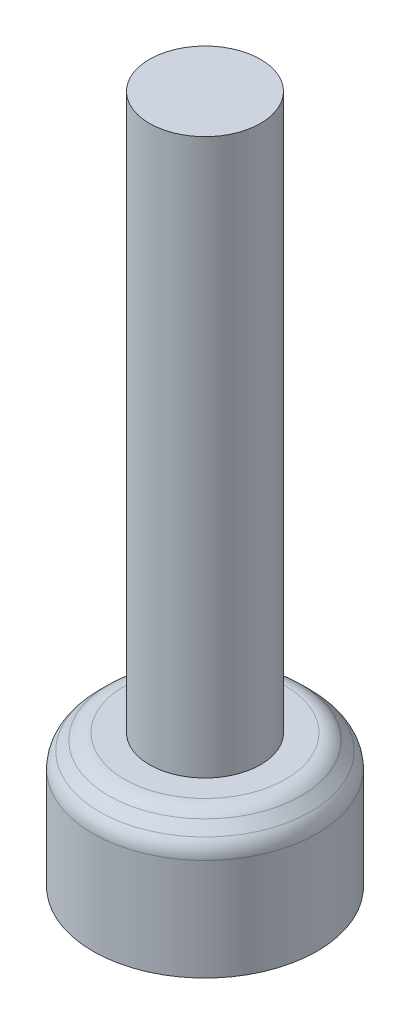
ISO-10303-21;
HEADER;
FILE_DESCRIPTION(('STEP AP214'),'2;1');
FILE_NAME('part.step','',(''),(''),'','','');
FILE_SCHEMA(('AUTOMOTIVE_DESIGN { 1 0 10303 214 1 1 1 1 }'));
ENDSEC;
DATA;
#1=APPLICATION_CONTEXT('core data for automotive mechanical design processes');
#2=APPLICATION_PROTOCOL_DEFINITION('international standard','automotive_design',2000,#1);
#3=PRODUCT_CONTEXT('',#1,'mechanical');
#4=PRODUCT('Part','Part','',(#3));
#5=PRODUCT_RELATED_PRODUCT_CATEGORY('part','',(#4));
#6=PRODUCT_DEFINITION_FORMATION('','',#4);
#7=PRODUCT_DEFINITION_CONTEXT('part definition',#1,'design');
#8=PRODUCT_DEFINITION('design','',#6,#7);
#9=PRODUCT_DEFINITION_SHAPE('','',#8);
#10=(LENGTH_UNIT() NAMED_UNIT(*) SI_UNIT(.MILLI.,.METRE.));
#11=(NAMED_UNIT(*) PLANE_ANGLE_UNIT() SI_UNIT($,.RADIAN.));
#12=(NAMED_UNIT(*) SI_UNIT($,.STERADIAN.) SOLID_ANGLE_UNIT());
#13=UNCERTAINTY_MEASURE_WITH_UNIT(LENGTH_MEASURE(1.E-05),#10,'distance_accuracy_value','');
#14=(GEOMETRIC_REPRESENTATION_CONTEXT(3) GLOBAL_UNCERTAINTY_ASSIGNED_CONTEXT((#13)) GLOBAL_UNIT_ASSIGNED_CONTEXT((#10,
#11,#12)) REPRESENTATION_CONTEXT('',''));
#15=CARTESIAN_POINT('',(0.,0.,0.));
#16=DIRECTION('',(0.,0.,1.));
#17=DIRECTION('',(1.,0.,0.));
#18=AXIS2_PLACEMENT_3D('',#15,#16,#17);
#19=CARTESIAN_POINT('',(0.,50.,0.));
#20=DIRECTION('',(0.,-1.,0.));
#21=DIRECTION('',(0.,0.,-1.));
#22=AXIS2_PLACEMENT_3D('',#19,#20,#21);
#23=CYLINDRICAL_SURFACE('',#22,5.);
#24=CARTESIAN_POINT('',(0.,50.,0.));
#25=DIRECTION('',(0.,1.,0.));
#26=DIRECTION('',(0.,0.,1.));
#27=AXIS2_PLACEMENT_3D('',#24,#25,#26);
#28=CIRCLE('',#27,5.);
#29=CARTESIAN_POINT('',(0.,50.,5.));
#30=VERTEX_POINT('',#29);
#31=EDGE_CURVE('E67',#30,#30,#28,.T.);
#32=ORIENTED_EDGE('',*,*,#31,.F.);
#33=EDGE_LOOP('',(#32));
#34=FACE_BOUND('',#33,.T.);
#35=CARTESIAN_POINT('',(0.,0.,0.));
#36=DIRECTION('',(0.,1.,0.));
#37=DIRECTION('',(0.,0.,1.));
#38=AXIS2_PLACEMENT_3D('',#35,#36,#37);
#39=CIRCLE('',#38,5.);
#40=CARTESIAN_POINT('',(0.,0.,5.));
#41=VERTEX_POINT('',#40);
#42=EDGE_CURVE('E68',#41,#41,#39,.T.);
#43=ORIENTED_EDGE('',*,*,#42,.T.);
#44=EDGE_LOOP('',(#43));
#45=FACE_BOUND('',#44,.T.);
#46=ADVANCED_FACE('F43',(#34,#45),#23,.T.);
#47=CARTESIAN_POINT('',(0.,50.,0.));
#48=DIRECTION('',(0.,1.,0.));
#49=DIRECTION('',(0.,0.,1.));
#50=AXIS2_PLACEMENT_3D('',#47,#48,#49);
#51=PLANE('',#50);
#52=ORIENTED_EDGE('',*,*,#31,.T.);
#53=EDGE_LOOP('',(#52));
#54=FACE_BOUND('',#53,.T.);
#55=ADVANCED_FACE('F84',(#54),#51,.T.);
#56=CARTESIAN_POINT('',(0.,-12.,0.));
#57=DIRECTION('',(0.,1.,0.));
#58=DIRECTION('',(0.,0.,1.));
#59=AXIS2_PLACEMENT_3D('',#56,#57,#58);
#60=CYLINDRICAL_SURFACE('',#59,10.0875754185799);
#61=CARTESIAN_POINT('',(0.,-2.82842712474619,0.));
#62=DIRECTION('',(0.,1.,0.));
#63=DIRECTION('',(0.,0.,1.));
#64=AXIS2_PLACEMENT_3D('',#61,#62,#63);
#65=CIRCLE('',#64,10.0875754185799);
#66=CARTESIAN_POINT('',(0.,-2.82842712474619,10.0875754185799));
#67=VERTEX_POINT('',#66);
#68=EDGE_CURVE('E51',#67,#67,#65,.F.);
#69=ORIENTED_EDGE('',*,*,#68,.T.);
#70=EDGE_LOOP('',(#69));
#71=FACE_BOUND('',#70,.T.);
#72=CARTESIAN_POINT('',(0.,-12.,0.));
#73=DIRECTION('',(0.,-1.,0.));
#74=DIRECTION('',(0.,0.,-1.));
#75=AXIS2_PLACEMENT_3D('',#72,#73,#74);
#76=CIRCLE('',#75,10.0875754185799);
#77=CARTESIAN_POINT('',(0.,-12.,-10.0875754185799));
#78=VERTEX_POINT('',#77);
#79=EDGE_CURVE('E72',#78,#78,#76,.T.);
#80=ORIENTED_EDGE('',*,*,#79,.F.);
#81=EDGE_LOOP('',(#80));
#82=FACE_BOUND('',#81,.T.);
#83=ADVANCED_FACE('F82',(#71,#82),#60,.T.);
#84=CARTESIAN_POINT('',(0.,-12.,0.));
#85=DIRECTION('',(0.,-1.,0.));
#86=DIRECTION('',(0.,0.,-1.));
#87=AXIS2_PLACEMENT_3D('',#84,#85,#86);
#88=PLANE('',#87);
#89=ORIENTED_EDGE('',*,*,#79,.T.);
#90=EDGE_LOOP('',(#89));
#91=FACE_BOUND('',#90,.T.);
#92=ADVANCED_FACE('F80',(#91),#88,.T.);
#93=CARTESIAN_POINT('',(0.,0.,0.));
#94=DIRECTION('',(0.,-1.,0.));
#95=DIRECTION('',(0.,0.,-1.));
#96=AXIS2_PLACEMENT_3D('',#93,#94,#95);
#97=PLANE('',#96);
#98=CARTESIAN_POINT('',(0.,0.,0.));
#99=DIRECTION('',(0.,-1.,0.));
#100=DIRECTION('',(0.,0.,-1.));
#101=AXIS2_PLACEMENT_3D('',#98,#99,#100);
#102=CIRCLE('',#101,7.25914829383371);
#103=CARTESIAN_POINT('',(0.,0.,-7.25914829383371));
#104=VERTEX_POINT('',#103);
#105=EDGE_CURVE('E61',#104,#104,#102,.F.);
#106=ORIENTED_EDGE('',*,*,#105,.T.);
#107=EDGE_LOOP('',(#106));
#108=FACE_BOUND('',#107,.T.);
#109=ORIENTED_EDGE('',*,*,#42,.F.);
#110=EDGE_LOOP('',(#109));
#111=FACE_BOUND('',#110,.T.);
#112=ADVANCED_FACE('F90',(#108,#111),#97,.F.);
#113=CARTESIAN_POINT('',(0.,-2.,0.));
#114=DIRECTION('',(0.,-1.,0.));
#115=DIRECTION('',(0.,0.,-1.));
#116=AXIS2_PLACEMENT_3D('',#113,#114,#115);
#117=CONICAL_SURFACE('',#116,10.0875754185799,0.78539816339745);
#118=CARTESIAN_POINT('',(0.,-1.41421356237309,0.));
#119=DIRECTION('',(0.,-1.,0.));
#120=DIRECTION('',(0.,0.,-1.));
#121=AXIS2_PLACEMENT_3D('',#118,#119,#120);
#122=CIRCLE('',#121,9.501788980953);
#123=CARTESIAN_POINT('',(0.,-1.41421356237309,-9.501788980953));
#124=VERTEX_POINT('',#123);
#125=EDGE_CURVE('E10',#124,#124,#122,.F.);
#126=ORIENTED_EDGE('',*,*,#125,.T.);
#127=EDGE_LOOP('',(#126));
#128=FACE_BOUND('',#127,.T.);
#129=CARTESIAN_POINT('',(0.,-0.585786437626903,0.));
#130=DIRECTION('',(0.,-1.,0.));
#131=DIRECTION('',(0.,0.,-1.));
#132=AXIS2_PLACEMENT_3D('',#129,#130,#131);
#133=CIRCLE('',#132,8.6733618562068);
#134=CARTESIAN_POINT('',(0.,-0.585786437626903,-8.6733618562068));
#135=VERTEX_POINT('',#134);
#136=EDGE_CURVE('E56',#135,#135,#133,.T.);
#137=ORIENTED_EDGE('',*,*,#136,.T.);
#138=EDGE_LOOP('',(#137));
#139=FACE_BOUND('',#138,.T.);
#140=ADVANCED_FACE('F104',(#128,#139),#117,.T.);
#141=CARTESIAN_POINT('',(0.,-2.,0.));
#142=DIRECTION('',(0.,-1.,0.));
#143=DIRECTION('',(0.,0.,-1.));
#144=AXIS2_PLACEMENT_3D('',#141,#142,#143);
#145=TOROIDAL_SURFACE('',#144,7.25914829383371,2.);
#146=ORIENTED_EDGE('',*,*,#136,.F.);
#147=EDGE_LOOP('',(#146));
#148=FACE_BOUND('',#147,.T.);
#149=ORIENTED_EDGE('',*,*,#105,.F.);
#150=EDGE_LOOP('',(#149));
#151=FACE_BOUND('',#150,.T.);
#152=ADVANCED_FACE('F108',(#148,#151),#145,.T.);
#153=CARTESIAN_POINT('',(0.,-2.82842712474619,0.));
#154=DIRECTION('',(0.,1.,0.));
#155=DIRECTION('',(0.,0.,1.));
#156=AXIS2_PLACEMENT_3D('',#153,#154,#155);
#157=TOROIDAL_SURFACE('',#156,8.08757541857991,2.);
#158=ORIENTED_EDGE('',*,*,#125,.F.);
#159=EDGE_LOOP('',(#158));
#160=FACE_BOUND('',#159,.T.);
#161=ORIENTED_EDGE('',*,*,#68,.F.);
#162=EDGE_LOOP('',(#161));
#163=FACE_BOUND('',#162,.T.);
#164=ADVANCED_FACE('F45',(#160,#163),#157,.T.);
#165=CLOSED_SHELL('',(#46,#55,#83,#92,#112,#140,#152,#164));
#166=MANIFOLD_SOLID_BREP('B2',#165);
#167=ADVANCED_BREP_SHAPE_REPRESENTATION('',(#18,#166),#14);
#168=SHAPE_DEFINITION_REPRESENTATION(#9,#167);
ENDSEC;
END-ISO-10303-21;
